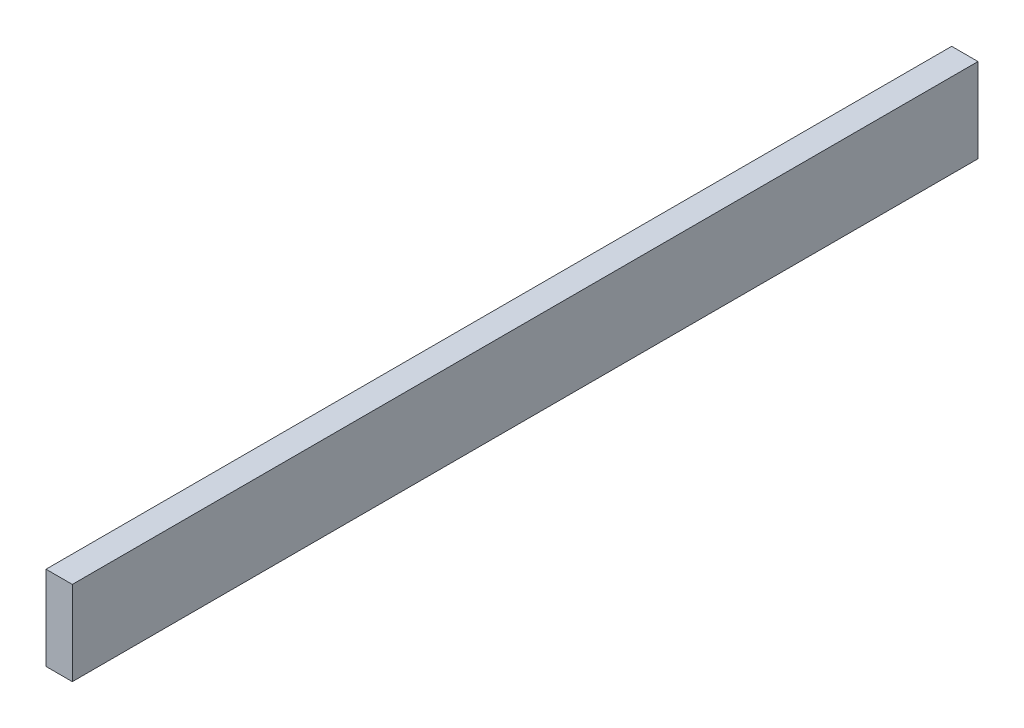
ISO-10303-21;
HEADER;
FILE_DESCRIPTION(('STEP AP214'),'2;1');
FILE_NAME('part.step','',(''),(''),'','','');
FILE_SCHEMA(('AUTOMOTIVE_DESIGN { 1 0 10303 214 1 1 1 1 }'));
ENDSEC;
DATA;
#1=APPLICATION_CONTEXT('core data for automotive mechanical design processes');
#2=APPLICATION_PROTOCOL_DEFINITION('international standard','automotive_design',2000,#1);
#3=PRODUCT_CONTEXT('',#1,'mechanical');
#4=PRODUCT('Part','Part','',(#3));
#5=PRODUCT_RELATED_PRODUCT_CATEGORY('part','',(#4));
#6=PRODUCT_DEFINITION_FORMATION('','',#4);
#7=PRODUCT_DEFINITION_CONTEXT('part definition',#1,'design');
#8=PRODUCT_DEFINITION('design','',#6,#7);
#9=PRODUCT_DEFINITION_SHAPE('','',#8);
#10=(LENGTH_UNIT() NAMED_UNIT(*) SI_UNIT(.MILLI.,.METRE.));
#11=(NAMED_UNIT(*) PLANE_ANGLE_UNIT() SI_UNIT($,.RADIAN.));
#12=(NAMED_UNIT(*) SI_UNIT($,.STERADIAN.) SOLID_ANGLE_UNIT());
#13=UNCERTAINTY_MEASURE_WITH_UNIT(LENGTH_MEASURE(1.E-05),#10,'distance_accuracy_value','');
#14=(GEOMETRIC_REPRESENTATION_CONTEXT(3) GLOBAL_UNCERTAINTY_ASSIGNED_CONTEXT((#13)) GLOBAL_UNIT_ASSIGNED_CONTEXT((#10,
#11,#12)) REPRESENTATION_CONTEXT('',''));
#15=CARTESIAN_POINT('',(0.,0.,0.));
#16=DIRECTION('',(0.,0.,1.));
#17=DIRECTION('',(1.,0.,0.));
#18=AXIS2_PLACEMENT_3D('',#15,#16,#17);
#19=CARTESIAN_POINT('',(12.5,80.,430.));
#20=DIRECTION('',(-1.,0.,0.));
#21=DIRECTION('',(0.,0.,1.));
#22=AXIS2_PLACEMENT_3D('',#19,#20,#21);
#23=PLANE('',#22);
#24=DIRECTION('',(0.,0.,-1.));
#25=VECTOR('',#24,1.);
#26=CARTESIAN_POINT('',(12.5,0.,430.));
#27=LINE('',#26,#25);
#28=CARTESIAN_POINT('',(12.5,0.,430.));
#29=VERTEX_POINT('',#28);
#30=CARTESIAN_POINT('',(12.5,0.,-430.));
#31=VERTEX_POINT('',#30);
#32=EDGE_CURVE('E102',#29,#31,#27,.T.);
#33=ORIENTED_EDGE('',*,*,#32,.T.);
#34=DIRECTION('',(0.,-1.,0.));
#35=VECTOR('',#34,1.);
#36=CARTESIAN_POINT('',(12.5,80.,-430.));
#37=LINE('',#36,#35);
#38=CARTESIAN_POINT('',(12.5,80.,-430.));
#39=VERTEX_POINT('',#38);
#40=EDGE_CURVE('E11',#39,#31,#37,.T.);
#41=ORIENTED_EDGE('',*,*,#40,.F.);
#42=DIRECTION('',(0.,0.,-1.));
#43=VECTOR('',#42,1.);
#44=CARTESIAN_POINT('',(12.5,80.,430.));
#45=LINE('',#44,#43);
#46=CARTESIAN_POINT('',(12.5,80.,430.));
#47=VERTEX_POINT('',#46);
#48=EDGE_CURVE('E90',#47,#39,#45,.T.);
#49=ORIENTED_EDGE('',*,*,#48,.F.);
#50=DIRECTION('',(0.,-1.,0.));
#51=VECTOR('',#50,1.);
#52=CARTESIAN_POINT('',(12.5,80.,430.));
#53=LINE('',#52,#51);
#54=EDGE_CURVE('E98',#47,#29,#53,.T.);
#55=ORIENTED_EDGE('',*,*,#54,.T.);
#56=EDGE_LOOP('',(#33,#41,#49,#55));
#57=FACE_BOUND('',#56,.T.);
#58=ADVANCED_FACE('F39',(#57),#23,.F.);
#59=CARTESIAN_POINT('',(-12.5,80.,-430.));
#60=DIRECTION('',(0.,0.,1.));
#61=DIRECTION('',(1.,0.,0.));
#62=AXIS2_PLACEMENT_3D('',#59,#60,#61);
#63=PLANE('',#62);
#64=DIRECTION('',(-1.,0.,0.));
#65=VECTOR('',#64,1.);
#66=CARTESIAN_POINT('',(-12.5,0.,-430.));
#67=LINE('',#66,#65);
#68=CARTESIAN_POINT('',(-12.5,0.,-430.));
#69=VERTEX_POINT('',#68);
#70=EDGE_CURVE('E94',#31,#69,#67,.T.);
#71=ORIENTED_EDGE('',*,*,#70,.T.);
#72=DIRECTION('',(0.,-1.,0.));
#73=VECTOR('',#72,1.);
#74=CARTESIAN_POINT('',(-12.5,80.,-430.));
#75=LINE('',#74,#73);
#76=CARTESIAN_POINT('',(-12.5,80.,-430.));
#77=VERTEX_POINT('',#76);
#78=EDGE_CURVE('E47',#77,#69,#75,.T.);
#79=ORIENTED_EDGE('',*,*,#78,.F.);
#80=DIRECTION('',(-1.,0.,0.));
#81=VECTOR('',#80,1.);
#82=CARTESIAN_POINT('',(-12.5,80.,-430.));
#83=LINE('',#82,#81);
#84=EDGE_CURVE('E85',#39,#77,#83,.T.);
#85=ORIENTED_EDGE('',*,*,#84,.F.);
#86=ORIENTED_EDGE('',*,*,#40,.T.);
#87=EDGE_LOOP('',(#71,#79,#85,#86));
#88=FACE_BOUND('',#87,.T.);
#89=ADVANCED_FACE('F93',(#88),#63,.F.);
#90=CARTESIAN_POINT('',(-12.5,80.,430.));
#91=DIRECTION('',(1.,0.,0.));
#92=DIRECTION('',(0.,0.,-1.));
#93=AXIS2_PLACEMENT_3D('',#90,#91,#92);
#94=PLANE('',#93);
#95=DIRECTION('',(0.,0.,1.));
#96=VECTOR('',#95,1.);
#97=CARTESIAN_POINT('',(-12.5,0.,430.));
#98=LINE('',#97,#96);
#99=CARTESIAN_POINT('',(-12.5,0.,430.));
#100=VERTEX_POINT('',#99);
#101=EDGE_CURVE('E72',#69,#100,#98,.T.);
#102=ORIENTED_EDGE('',*,*,#101,.T.);
#103=DIRECTION('',(0.,-1.,0.));
#104=VECTOR('',#103,1.);
#105=CARTESIAN_POINT('',(-12.5,80.,430.));
#106=LINE('',#105,#104);
#107=CARTESIAN_POINT('',(-12.5,80.,430.));
#108=VERTEX_POINT('',#107);
#109=EDGE_CURVE('E95',#108,#100,#106,.T.);
#110=ORIENTED_EDGE('',*,*,#109,.F.);
#111=DIRECTION('',(0.,0.,1.));
#112=VECTOR('',#111,1.);
#113=CARTESIAN_POINT('',(-12.5,80.,430.));
#114=LINE('',#113,#112);
#115=EDGE_CURVE('E88',#77,#108,#114,.T.);
#116=ORIENTED_EDGE('',*,*,#115,.F.);
#117=ORIENTED_EDGE('',*,*,#78,.T.);
#118=EDGE_LOOP('',(#102,#110,#116,#117));
#119=FACE_BOUND('',#118,.T.);
#120=ADVANCED_FACE('F96',(#119),#94,.F.);
#121=CARTESIAN_POINT('',(-12.5,80.,430.));
#122=DIRECTION('',(0.,0.,-1.));
#123=DIRECTION('',(-1.,0.,0.));
#124=AXIS2_PLACEMENT_3D('',#121,#122,#123);
#125=PLANE('',#124);
#126=DIRECTION('',(1.,0.,0.));
#127=VECTOR('',#126,1.);
#128=CARTESIAN_POINT('',(-12.5,0.,430.));
#129=LINE('',#128,#127);
#130=EDGE_CURVE('E78',#100,#29,#129,.T.);
#131=ORIENTED_EDGE('',*,*,#130,.T.);
#132=ORIENTED_EDGE('',*,*,#54,.F.);
#133=DIRECTION('',(1.,0.,0.));
#134=VECTOR('',#133,1.);
#135=CARTESIAN_POINT('',(-12.5,80.,430.));
#136=LINE('',#135,#134);
#137=EDGE_CURVE('E55',#108,#47,#136,.T.);
#138=ORIENTED_EDGE('',*,*,#137,.F.);
#139=ORIENTED_EDGE('',*,*,#109,.T.);
#140=EDGE_LOOP('',(#131,#132,#138,#139));
#141=FACE_BOUND('',#140,.T.);
#142=ADVANCED_FACE('F109',(#141),#125,.F.);
#143=CARTESIAN_POINT('',(0.,80.,0.));
#144=DIRECTION('',(0.,-1.,0.));
#145=DIRECTION('',(0.,0.,-1.));
#146=AXIS2_PLACEMENT_3D('',#143,#144,#145);
#147=PLANE('',#146);
#148=ORIENTED_EDGE('',*,*,#48,.T.);
#149=ORIENTED_EDGE('',*,*,#84,.T.);
#150=ORIENTED_EDGE('',*,*,#115,.T.);
#151=ORIENTED_EDGE('',*,*,#137,.T.);
#152=EDGE_LOOP('',(#148,#149,#150,#151));
#153=FACE_BOUND('',#152,.T.);
#154=ADVANCED_FACE('F86',(#153),#147,.F.);
#155=CARTESIAN_POINT('',(0.,0.,0.));
#156=DIRECTION('',(0.,-1.,0.));
#157=DIRECTION('',(0.,0.,-1.));
#158=AXIS2_PLACEMENT_3D('',#155,#156,#157);
#159=PLANE('',#158);
#160=ORIENTED_EDGE('',*,*,#32,.F.);
#161=ORIENTED_EDGE('',*,*,#130,.F.);
#162=ORIENTED_EDGE('',*,*,#101,.F.);
#163=ORIENTED_EDGE('',*,*,#70,.F.);
#164=EDGE_LOOP('',(#160,#161,#162,#163));
#165=FACE_BOUND('',#164,.T.);
#166=ADVANCED_FACE('F112',(#165),#159,.T.);
#167=CLOSED_SHELL('',(#58,#89,#120,#142,#154,#166));
#168=MANIFOLD_SOLID_BREP('B2',#167);
#169=ADVANCED_BREP_SHAPE_REPRESENTATION('',(#18,#168),#14);
#170=SHAPE_DEFINITION_REPRESENTATION(#9,#169);
ENDSEC;
END-ISO-10303-21;
